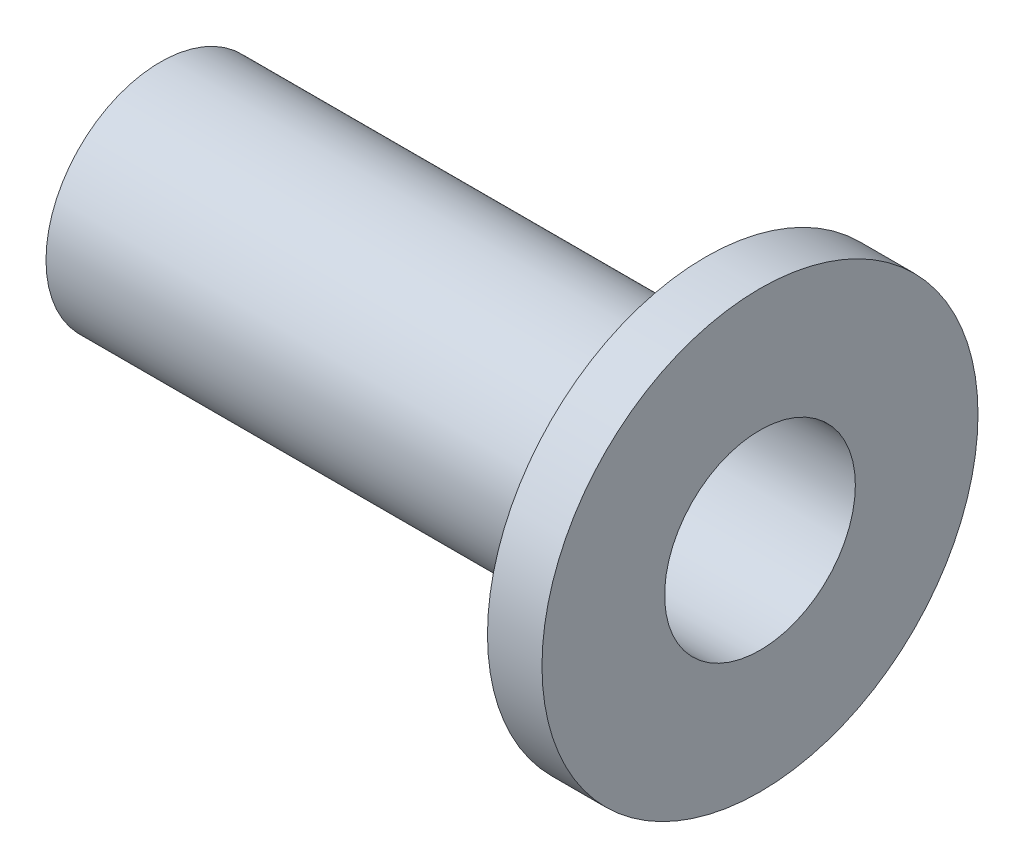
ISO-10303-21;
HEADER;
FILE_DESCRIPTION(('STEP AP214'),'2;1');
FILE_NAME('part.step','',(''),(''),'','','');
FILE_SCHEMA(('AUTOMOTIVE_DESIGN { 1 0 10303 214 1 1 1 1 }'));
ENDSEC;
DATA;
#1=APPLICATION_CONTEXT('core data for automotive mechanical design processes');
#2=APPLICATION_PROTOCOL_DEFINITION('international standard','automotive_design',2000,#1);
#3=PRODUCT_CONTEXT('',#1,'mechanical');
#4=PRODUCT('Part','Part','',(#3));
#5=PRODUCT_RELATED_PRODUCT_CATEGORY('part','',(#4));
#6=PRODUCT_DEFINITION_FORMATION('','',#4);
#7=PRODUCT_DEFINITION_CONTEXT('part definition',#1,'design');
#8=PRODUCT_DEFINITION('design','',#6,#7);
#9=PRODUCT_DEFINITION_SHAPE('','',#8);
#10=(LENGTH_UNIT() NAMED_UNIT(*) SI_UNIT(.MILLI.,.METRE.));
#11=(NAMED_UNIT(*) PLANE_ANGLE_UNIT() SI_UNIT($,.RADIAN.));
#12=(NAMED_UNIT(*) SI_UNIT($,.STERADIAN.) SOLID_ANGLE_UNIT());
#13=UNCERTAINTY_MEASURE_WITH_UNIT(LENGTH_MEASURE(1.E-05),#10,'distance_accuracy_value','');
#14=(GEOMETRIC_REPRESENTATION_CONTEXT(3) GLOBAL_UNCERTAINTY_ASSIGNED_CONTEXT((#13)) GLOBAL_UNIT_ASSIGNED_CONTEXT((#10,
#11,#12)) REPRESENTATION_CONTEXT('',''));
#15=CARTESIAN_POINT('',(0.,0.,0.));
#16=DIRECTION('',(0.,0.,1.));
#17=DIRECTION('',(1.,0.,0.));
#18=AXIS2_PLACEMENT_3D('',#15,#16,#17);
#19=CARTESIAN_POINT('',(-106.483217921525,24.9570042003574,0.));
#20=DIRECTION('',(-1.,0.,0.));
#21=DIRECTION('',(0.,0.,1.));
#22=AXIS2_PLACEMENT_3D('',#19,#20,#21);
#23=PLANE('',#22);
#24=CARTESIAN_POINT('',(-106.483217921525,22.8570042003574,0.));
#25=DIRECTION('',(1.,0.,0.));
#26=DIRECTION('',(0.,0.,-1.));
#27=AXIS2_PLACEMENT_3D('',#24,#25,#26);
#28=CIRCLE('',#27,1.75);
#29=CARTESIAN_POINT('',(-106.483217921525,22.8570042003574,-1.75));
#30=VERTEX_POINT('',#29);
#31=EDGE_CURVE('E10',#30,#30,#28,.T.);
#32=ORIENTED_EDGE('',*,*,#31,.T.);
#33=EDGE_LOOP('',(#32));
#34=FACE_BOUND('',#33,.T.);
#35=CARTESIAN_POINT('',(-106.483217921525,22.8570042003574,0.));
#36=DIRECTION('',(1.,0.,0.));
#37=DIRECTION('',(0.,0.,-1.));
#38=AXIS2_PLACEMENT_3D('',#35,#36,#37);
#39=CIRCLE('',#38,2.1);
#40=CARTESIAN_POINT('',(-106.483217921525,22.8570042003574,-2.1));
#41=VERTEX_POINT('',#40);
#42=EDGE_CURVE('E57',#41,#41,#39,.T.);
#43=ORIENTED_EDGE('',*,*,#42,.F.);
#44=EDGE_LOOP('',(#43));
#45=FACE_BOUND('',#44,.T.);
#46=ADVANCED_FACE('F35',(#34,#45),#23,.T.);
#47=CARTESIAN_POINT('',(-95.483217921525,22.8570042003574,0.));
#48=DIRECTION('',(1.,0.,0.));
#49=DIRECTION('',(0.,0.,-1.));
#50=AXIS2_PLACEMENT_3D('',#47,#48,#49);
#51=CYLINDRICAL_SURFACE('',#50,1.75);
#52=CARTESIAN_POINT('',(-95.483217921525,22.8570042003574,0.));
#53=DIRECTION('',(1.,0.,0.));
#54=DIRECTION('',(0.,0.,-1.));
#55=AXIS2_PLACEMENT_3D('',#52,#53,#54);
#56=CIRCLE('',#55,1.75);
#57=CARTESIAN_POINT('',(-95.483217921525,22.8570042003574,-1.75));
#58=VERTEX_POINT('',#57);
#59=EDGE_CURVE('E41',#58,#58,#56,.T.);
#60=ORIENTED_EDGE('',*,*,#59,.T.);
#61=EDGE_LOOP('',(#60));
#62=FACE_BOUND('',#61,.T.);
#63=ORIENTED_EDGE('',*,*,#31,.F.);
#64=EDGE_LOOP('',(#63));
#65=FACE_BOUND('',#64,.T.);
#66=ADVANCED_FACE('F65',(#62,#65),#51,.F.);
#67=CARTESIAN_POINT('',(-95.483217921525,26.8570042003574,0.));
#68=DIRECTION('',(1.,0.,0.));
#69=DIRECTION('',(0.,0.,-1.));
#70=AXIS2_PLACEMENT_3D('',#67,#68,#69);
#71=PLANE('',#70);
#72=CARTESIAN_POINT('',(-95.483217921525,22.8570042003574,0.));
#73=DIRECTION('',(1.,0.,0.));
#74=DIRECTION('',(0.,0.,-1.));
#75=AXIS2_PLACEMENT_3D('',#72,#73,#74);
#76=CIRCLE('',#75,4.);
#77=CARTESIAN_POINT('',(-95.483217921525,22.8570042003574,-4.));
#78=VERTEX_POINT('',#77);
#79=EDGE_CURVE('E45',#78,#78,#76,.T.);
#80=ORIENTED_EDGE('',*,*,#79,.T.);
#81=EDGE_LOOP('',(#80));
#82=FACE_BOUND('',#81,.T.);
#83=ORIENTED_EDGE('',*,*,#59,.F.);
#84=EDGE_LOOP('',(#83));
#85=FACE_BOUND('',#84,.T.);
#86=ADVANCED_FACE('F69',(#82,#85),#71,.T.);
#87=CARTESIAN_POINT('',(-95.483217921525,22.8570042003574,0.));
#88=DIRECTION('',(1.,0.,0.));
#89=DIRECTION('',(0.,0.,-1.));
#90=AXIS2_PLACEMENT_3D('',#87,#88,#89);
#91=CYLINDRICAL_SURFACE('',#90,4.);
#92=CARTESIAN_POINT('',(-96.483217921525,22.8570042003574,0.));
#93=DIRECTION('',(1.,0.,0.));
#94=DIRECTION('',(0.,0.,-1.));
#95=AXIS2_PLACEMENT_3D('',#92,#93,#94);
#96=CIRCLE('',#95,4.);
#97=CARTESIAN_POINT('',(-96.483217921525,22.8570042003574,-4.));
#98=VERTEX_POINT('',#97);
#99=EDGE_CURVE('E49',#98,#98,#96,.T.);
#100=ORIENTED_EDGE('',*,*,#99,.T.);
#101=EDGE_LOOP('',(#100));
#102=FACE_BOUND('',#101,.T.);
#103=ORIENTED_EDGE('',*,*,#79,.F.);
#104=EDGE_LOOP('',(#103));
#105=FACE_BOUND('',#104,.T.);
#106=ADVANCED_FACE('F73',(#102,#105),#91,.T.);
#107=CARTESIAN_POINT('',(-96.483217921525,24.9570042003574,0.));
#108=DIRECTION('',(-1.,0.,0.));
#109=DIRECTION('',(0.,0.,1.));
#110=AXIS2_PLACEMENT_3D('',#107,#108,#109);
#111=PLANE('',#110);
#112=CARTESIAN_POINT('',(-96.483217921525,22.8570042003574,0.));
#113=DIRECTION('',(1.,0.,0.));
#114=DIRECTION('',(0.,0.,-1.));
#115=AXIS2_PLACEMENT_3D('',#112,#113,#114);
#116=CIRCLE('',#115,2.1);
#117=CARTESIAN_POINT('',(-96.483217921525,22.8570042003574,-2.1));
#118=VERTEX_POINT('',#117);
#119=EDGE_CURVE('E54',#118,#118,#116,.T.);
#120=ORIENTED_EDGE('',*,*,#119,.T.);
#121=EDGE_LOOP('',(#120));
#122=FACE_BOUND('',#121,.T.);
#123=ORIENTED_EDGE('',*,*,#99,.F.);
#124=EDGE_LOOP('',(#123));
#125=FACE_BOUND('',#124,.T.);
#126=ADVANCED_FACE('F80',(#122,#125),#111,.T.);
#127=CARTESIAN_POINT('',(-95.483217921525,22.8570042003574,0.));
#128=DIRECTION('',(1.,0.,0.));
#129=DIRECTION('',(0.,0.,-1.));
#130=AXIS2_PLACEMENT_3D('',#127,#128,#129);
#131=CYLINDRICAL_SURFACE('',#130,2.1);
#132=ORIENTED_EDGE('',*,*,#42,.T.);
#133=EDGE_LOOP('',(#132));
#134=FACE_BOUND('',#133,.T.);
#135=ORIENTED_EDGE('',*,*,#119,.F.);
#136=EDGE_LOOP('',(#135));
#137=FACE_BOUND('',#136,.T.);
#138=ADVANCED_FACE('F61',(#134,#137),#131,.T.);
#139=CLOSED_SHELL('',(#46,#66,#86,#106,#126,#138));
#140=MANIFOLD_SOLID_BREP('B2',#139);
#141=ADVANCED_BREP_SHAPE_REPRESENTATION('',(#18,#140),#14);
#142=SHAPE_DEFINITION_REPRESENTATION(#9,#141);
ENDSEC;
END-ISO-10303-21;
